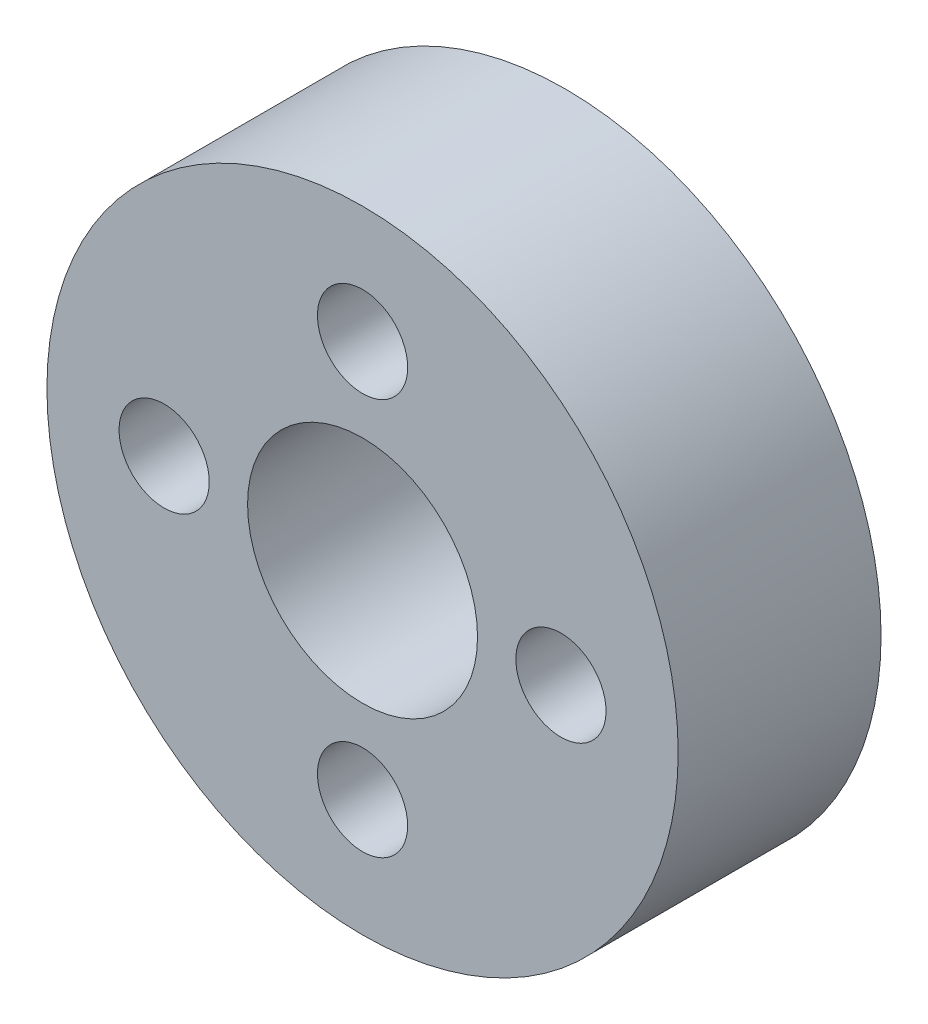
ISO-10303-21;
HEADER;
FILE_DESCRIPTION(('STEP AP214'),'2;1');
FILE_NAME('part.step','',(''),(''),'','','');
FILE_SCHEMA(('AUTOMOTIVE_DESIGN { 1 0 10303 214 1 1 1 1 }'));
ENDSEC;
DATA;
#1=APPLICATION_CONTEXT('core data for automotive mechanical design processes');
#2=APPLICATION_PROTOCOL_DEFINITION('international standard','automotive_design',2000,#1);
#3=PRODUCT_CONTEXT('',#1,'mechanical');
#4=PRODUCT('Part','Part','',(#3));
#5=PRODUCT_RELATED_PRODUCT_CATEGORY('part','',(#4));
#6=PRODUCT_DEFINITION_FORMATION('','',#4);
#7=PRODUCT_DEFINITION_CONTEXT('part definition',#1,'design');
#8=PRODUCT_DEFINITION('design','',#6,#7);
#9=PRODUCT_DEFINITION_SHAPE('','',#8);
#10=(LENGTH_UNIT() NAMED_UNIT(*) SI_UNIT(.MILLI.,.METRE.));
#11=(NAMED_UNIT(*) PLANE_ANGLE_UNIT() SI_UNIT($,.RADIAN.));
#12=(NAMED_UNIT(*) SI_UNIT($,.STERADIAN.) SOLID_ANGLE_UNIT());
#13=UNCERTAINTY_MEASURE_WITH_UNIT(LENGTH_MEASURE(1.E-05),#10,'distance_accuracy_value','');
#14=(GEOMETRIC_REPRESENTATION_CONTEXT(3) GLOBAL_UNCERTAINTY_ASSIGNED_CONTEXT((#13)) GLOBAL_UNIT_ASSIGNED_CONTEXT((#10,
#11,#12)) REPRESENTATION_CONTEXT('',''));
#15=CARTESIAN_POINT('',(0.,0.,0.));
#16=DIRECTION('',(0.,0.,1.));
#17=DIRECTION('',(1.,0.,0.));
#18=AXIS2_PLACEMENT_3D('',#15,#16,#17);
#19=CARTESIAN_POINT('',(0.,0.,0.));
#20=DIRECTION('',(0.,0.,1.));
#21=DIRECTION('',(1.,0.,0.));
#22=AXIS2_PLACEMENT_3D('',#19,#20,#21);
#23=PLANE('',#22);
#24=CARTESIAN_POINT('',(0.,-11.176,0.));
#25=DIRECTION('',(0.,0.,1.));
#26=DIRECTION('',(1.,0.,0.));
#27=AXIS2_PLACEMENT_3D('',#24,#25,#26);
#28=CIRCLE('',#27,2.54);
#29=CARTESIAN_POINT('',(2.54,-11.176,0.));
#30=VERTEX_POINT('',#29);
#31=EDGE_CURVE('E98',#30,#30,#28,.T.);
#32=ORIENTED_EDGE('',*,*,#31,.T.);
#33=EDGE_LOOP('',(#32));
#34=FACE_BOUND('',#33,.T.);
#35=CARTESIAN_POINT('',(0.,11.176,0.));
#36=DIRECTION('',(0.,0.,1.));
#37=DIRECTION('',(1.,0.,0.));
#38=AXIS2_PLACEMENT_3D('',#35,#36,#37);
#39=CIRCLE('',#38,2.54);
#40=CARTESIAN_POINT('',(2.54,11.176,0.));
#41=VERTEX_POINT('',#40);
#42=EDGE_CURVE('E108',#41,#41,#39,.T.);
#43=ORIENTED_EDGE('',*,*,#42,.T.);
#44=EDGE_LOOP('',(#43));
#45=FACE_BOUND('',#44,.T.);
#46=CARTESIAN_POINT('',(11.176,0.,0.));
#47=DIRECTION('',(0.,0.,1.));
#48=DIRECTION('',(1.,0.,0.));
#49=AXIS2_PLACEMENT_3D('',#46,#47,#48);
#50=CIRCLE('',#49,2.54);
#51=CARTESIAN_POINT('',(13.716,0.,0.));
#52=VERTEX_POINT('',#51);
#53=EDGE_CURVE('E113',#52,#52,#50,.T.);
#54=ORIENTED_EDGE('',*,*,#53,.T.);
#55=EDGE_LOOP('',(#54));
#56=FACE_BOUND('',#55,.T.);
#57=CARTESIAN_POINT('',(-11.176,0.,0.));
#58=DIRECTION('',(0.,0.,1.));
#59=DIRECTION('',(1.,0.,0.));
#60=AXIS2_PLACEMENT_3D('',#57,#58,#59);
#61=CIRCLE('',#60,2.54);
#62=CARTESIAN_POINT('',(-8.636,0.,0.));
#63=VERTEX_POINT('',#62);
#64=EDGE_CURVE('E119',#63,#63,#61,.T.);
#65=ORIENTED_EDGE('',*,*,#64,.T.);
#66=EDGE_LOOP('',(#65));
#67=FACE_BOUND('',#66,.T.);
#68=CARTESIAN_POINT('',(0.,0.,0.));
#69=DIRECTION('',(0.,0.,1.));
#70=DIRECTION('',(1.,0.,0.));
#71=AXIS2_PLACEMENT_3D('',#68,#69,#70);
#72=CIRCLE('',#71,17.78);
#73=CARTESIAN_POINT('',(17.78,0.,0.));
#74=VERTEX_POINT('',#73);
#75=EDGE_CURVE('E39',#74,#74,#72,.T.);
#76=ORIENTED_EDGE('',*,*,#75,.F.);
#77=EDGE_LOOP('',(#76));
#78=FACE_BOUND('',#77,.T.);
#79=DIRECTION('',(0.,1.,0.));
#80=VECTOR('',#79,1.);
#81=CARTESIAN_POINT('',(-8.255,-8.255,0.));
#82=LINE('',#81,#80);
#83=CARTESIAN_POINT('',(-8.255,-8.255,0.));
#84=VERTEX_POINT('',#83);
#85=CARTESIAN_POINT('',(-8.255,8.255,0.));
#86=VERTEX_POINT('',#85);
#87=EDGE_CURVE('E97',#84,#86,#82,.T.);
#88=ORIENTED_EDGE('',*,*,#87,.F.);
#89=DIRECTION('',(-1.,0.,0.));
#90=VECTOR('',#89,1.);
#91=CARTESIAN_POINT('',(8.255,-8.255,0.));
#92=LINE('',#91,#90);
#93=CARTESIAN_POINT('',(8.255,-8.255,0.));
#94=VERTEX_POINT('',#93);
#95=EDGE_CURVE('E94',#94,#84,#92,.T.);
#96=ORIENTED_EDGE('',*,*,#95,.F.);
#97=DIRECTION('',(0.,-1.,0.));
#98=VECTOR('',#97,1.);
#99=CARTESIAN_POINT('',(8.255,-8.255,0.));
#100=LINE('',#99,#98);
#101=CARTESIAN_POINT('',(8.255,8.255,0.));
#102=VERTEX_POINT('',#101);
#103=EDGE_CURVE('E55',#102,#94,#100,.T.);
#104=ORIENTED_EDGE('',*,*,#103,.F.);
#105=DIRECTION('',(1.,0.,0.));
#106=VECTOR('',#105,1.);
#107=CARTESIAN_POINT('',(8.255,8.255,0.));
#108=LINE('',#107,#106);
#109=EDGE_CURVE('E50',#86,#102,#108,.T.);
#110=ORIENTED_EDGE('',*,*,#109,.F.);
#111=EDGE_LOOP('',(#88,#96,#104,#110));
#112=FACE_BOUND('',#111,.T.);
#113=ADVANCED_FACE('F35',(#34,#45,#56,#67,#78,#112),#23,.F.);
#114=CARTESIAN_POINT('',(0.,0.,11.43));
#115=DIRECTION('',(0.,0.,1.));
#116=DIRECTION('',(1.,0.,0.));
#117=AXIS2_PLACEMENT_3D('',#114,#115,#116);
#118=PLANE('',#117);
#119=CARTESIAN_POINT('',(0.,11.176,11.43));
#120=DIRECTION('',(0.,0.,1.));
#121=DIRECTION('',(1.,0.,0.));
#122=AXIS2_PLACEMENT_3D('',#119,#120,#121);
#123=CIRCLE('',#122,2.54);
#124=CARTESIAN_POINT('',(2.54,11.176,11.43));
#125=VERTEX_POINT('',#124);
#126=EDGE_CURVE('E110',#125,#125,#123,.T.);
#127=ORIENTED_EDGE('',*,*,#126,.F.);
#128=EDGE_LOOP('',(#127));
#129=FACE_BOUND('',#128,.T.);
#130=CARTESIAN_POINT('',(-11.176,0.,11.43));
#131=DIRECTION('',(0.,0.,1.));
#132=DIRECTION('',(1.,0.,0.));
#133=AXIS2_PLACEMENT_3D('',#130,#131,#132);
#134=CIRCLE('',#133,2.54);
#135=CARTESIAN_POINT('',(-8.636,0.,11.43));
#136=VERTEX_POINT('',#135);
#137=EDGE_CURVE('E122',#136,#136,#134,.T.);
#138=ORIENTED_EDGE('',*,*,#137,.F.);
#139=EDGE_LOOP('',(#138));
#140=FACE_BOUND('',#139,.T.);
#141=CARTESIAN_POINT('',(0.,0.,11.43));
#142=DIRECTION('',(0.,0.,1.));
#143=DIRECTION('',(1.,0.,0.));
#144=AXIS2_PLACEMENT_3D('',#141,#142,#143);
#145=CIRCLE('',#144,17.78);
#146=CARTESIAN_POINT('',(17.78,0.,11.43));
#147=VERTEX_POINT('',#146);
#148=EDGE_CURVE('E11',#147,#147,#145,.T.);
#149=ORIENTED_EDGE('',*,*,#148,.T.);
#150=EDGE_LOOP('',(#149));
#151=FACE_BOUND('',#150,.T.);
#152=CARTESIAN_POINT('',(0.,0.,11.43));
#153=DIRECTION('',(0.,0.,1.));
#154=DIRECTION('',(1.,0.,0.));
#155=AXIS2_PLACEMENT_3D('',#152,#153,#154);
#156=CIRCLE('',#155,6.477);
#157=CARTESIAN_POINT('',(6.477,0.,11.43));
#158=VERTEX_POINT('',#157);
#159=EDGE_CURVE('E125',#158,#158,#156,.T.);
#160=ORIENTED_EDGE('',*,*,#159,.F.);
#161=EDGE_LOOP('',(#160));
#162=FACE_BOUND('',#161,.T.);
#163=CARTESIAN_POINT('',(11.176,0.,11.43));
#164=DIRECTION('',(0.,0.,1.));
#165=DIRECTION('',(1.,0.,0.));
#166=AXIS2_PLACEMENT_3D('',#163,#164,#165);
#167=CIRCLE('',#166,2.54);
#168=CARTESIAN_POINT('',(13.716,0.,11.43));
#169=VERTEX_POINT('',#168);
#170=EDGE_CURVE('E116',#169,#169,#167,.T.);
#171=ORIENTED_EDGE('',*,*,#170,.F.);
#172=EDGE_LOOP('',(#171));
#173=FACE_BOUND('',#172,.T.);
#174=CARTESIAN_POINT('',(0.,-11.176,11.43));
#175=DIRECTION('',(0.,0.,1.));
#176=DIRECTION('',(1.,0.,0.));
#177=AXIS2_PLACEMENT_3D('',#174,#175,#176);
#178=CIRCLE('',#177,2.54);
#179=CARTESIAN_POINT('',(2.54,-11.176,11.43));
#180=VERTEX_POINT('',#179);
#181=EDGE_CURVE('E101',#180,#180,#178,.T.);
#182=ORIENTED_EDGE('',*,*,#181,.F.);
#183=EDGE_LOOP('',(#182));
#184=FACE_BOUND('',#183,.T.);
#185=ADVANCED_FACE('F136',(#129,#140,#151,#162,#173,#184),#118,.T.);
#186=CARTESIAN_POINT('',(0.,0.,11.43));
#187=DIRECTION('',(0.,0.,-1.));
#188=DIRECTION('',(-1.,0.,0.));
#189=AXIS2_PLACEMENT_3D('',#186,#187,#188);
#190=CYLINDRICAL_SURFACE('',#189,17.78);
#191=ORIENTED_EDGE('',*,*,#148,.F.);
#192=EDGE_LOOP('',(#191));
#193=FACE_BOUND('',#192,.T.);
#194=ORIENTED_EDGE('',*,*,#75,.T.);
#195=EDGE_LOOP('',(#194));
#196=FACE_BOUND('',#195,.T.);
#197=ADVANCED_FACE('F37',(#193,#196),#190,.T.);
#198=CARTESIAN_POINT('',(0.,0.,11.43));
#199=DIRECTION('',(0.,0.,-1.));
#200=DIRECTION('',(-1.,0.,0.));
#201=AXIS2_PLACEMENT_3D('',#198,#199,#200);
#202=CYLINDRICAL_SURFACE('',#201,6.477);
#203=ORIENTED_EDGE('',*,*,#159,.T.);
#204=EDGE_LOOP('',(#203));
#205=FACE_BOUND('',#204,.T.);
#206=CARTESIAN_POINT('',(0.,0.,-3.175));
#207=DIRECTION('',(0.,0.,-1.));
#208=DIRECTION('',(-1.,0.,0.));
#209=AXIS2_PLACEMENT_3D('',#206,#207,#208);
#210=CIRCLE('',#209,6.477);
#211=CARTESIAN_POINT('',(-6.477,0.,-3.175));
#212=VERTEX_POINT('',#211);
#213=EDGE_CURVE('E139',#212,#212,#210,.T.);
#214=ORIENTED_EDGE('',*,*,#213,.T.);
#215=EDGE_LOOP('',(#214));
#216=FACE_BOUND('',#215,.T.);
#217=ADVANCED_FACE('F156',(#205,#216),#202,.F.);
#218=CARTESIAN_POINT('',(-11.176,0.,11.43));
#219=DIRECTION('',(0.,0.,-1.));
#220=DIRECTION('',(-1.,0.,0.));
#221=AXIS2_PLACEMENT_3D('',#218,#219,#220);
#222=CYLINDRICAL_SURFACE('',#221,2.54);
#223=ORIENTED_EDGE('',*,*,#137,.T.);
#224=EDGE_LOOP('',(#223));
#225=FACE_BOUND('',#224,.T.);
#226=ORIENTED_EDGE('',*,*,#64,.F.);
#227=EDGE_LOOP('',(#226));
#228=FACE_BOUND('',#227,.T.);
#229=ADVANCED_FACE('F183',(#225,#228),#222,.F.);
#230=CARTESIAN_POINT('',(11.176,0.,11.43));
#231=DIRECTION('',(0.,0.,-1.));
#232=DIRECTION('',(-1.,0.,0.));
#233=AXIS2_PLACEMENT_3D('',#230,#231,#232);
#234=CYLINDRICAL_SURFACE('',#233,2.54);
#235=ORIENTED_EDGE('',*,*,#170,.T.);
#236=EDGE_LOOP('',(#235));
#237=FACE_BOUND('',#236,.T.);
#238=ORIENTED_EDGE('',*,*,#53,.F.);
#239=EDGE_LOOP('',(#238));
#240=FACE_BOUND('',#239,.T.);
#241=ADVANCED_FACE('F179',(#237,#240),#234,.F.);
#242=CARTESIAN_POINT('',(0.,11.176,11.43));
#243=DIRECTION('',(0.,0.,-1.));
#244=DIRECTION('',(-1.,0.,0.));
#245=AXIS2_PLACEMENT_3D('',#242,#243,#244);
#246=CYLINDRICAL_SURFACE('',#245,2.54);
#247=ORIENTED_EDGE('',*,*,#126,.T.);
#248=EDGE_LOOP('',(#247));
#249=FACE_BOUND('',#248,.T.);
#250=ORIENTED_EDGE('',*,*,#42,.F.);
#251=EDGE_LOOP('',(#250));
#252=FACE_BOUND('',#251,.T.);
#253=ADVANCED_FACE('F165',(#249,#252),#246,.F.);
#254=CARTESIAN_POINT('',(0.,-11.176,11.43));
#255=DIRECTION('',(0.,0.,-1.));
#256=DIRECTION('',(-1.,0.,0.));
#257=AXIS2_PLACEMENT_3D('',#254,#255,#256);
#258=CYLINDRICAL_SURFACE('',#257,2.54);
#259=ORIENTED_EDGE('',*,*,#181,.T.);
#260=EDGE_LOOP('',(#259));
#261=FACE_BOUND('',#260,.T.);
#262=ORIENTED_EDGE('',*,*,#31,.F.);
#263=EDGE_LOOP('',(#262));
#264=FACE_BOUND('',#263,.T.);
#265=ADVANCED_FACE('F158',(#261,#264),#258,.F.);
#266=CARTESIAN_POINT('',(0.,0.,-3.175));
#267=DIRECTION('',(0.,0.,1.));
#268=DIRECTION('',(1.,0.,0.));
#269=AXIS2_PLACEMENT_3D('',#266,#267,#268);
#270=PLANE('',#269);
#271=DIRECTION('',(0.,1.,0.));
#272=VECTOR('',#271,1.);
#273=CARTESIAN_POINT('',(-8.255,-8.255,-3.175));
#274=LINE('',#273,#272);
#275=CARTESIAN_POINT('',(-8.255,-8.255,-3.175));
#276=VERTEX_POINT('',#275);
#277=CARTESIAN_POINT('',(-8.255,8.255,-3.175));
#278=VERTEX_POINT('',#277);
#279=EDGE_CURVE('E84',#276,#278,#274,.T.);
#280=ORIENTED_EDGE('',*,*,#279,.T.);
#281=DIRECTION('',(1.,0.,0.));
#282=VECTOR('',#281,1.);
#283=CARTESIAN_POINT('',(8.255,8.255,-3.175));
#284=LINE('',#283,#282);
#285=CARTESIAN_POINT('',(8.255,8.255,-3.175));
#286=VERTEX_POINT('',#285);
#287=EDGE_CURVE('E73',#278,#286,#284,.T.);
#288=ORIENTED_EDGE('',*,*,#287,.T.);
#289=DIRECTION('',(0.,-1.,0.));
#290=VECTOR('',#289,1.);
#291=CARTESIAN_POINT('',(8.255,-8.255,-3.175));
#292=LINE('',#291,#290);
#293=CARTESIAN_POINT('',(8.255,-8.255,-3.175));
#294=VERTEX_POINT('',#293);
#295=EDGE_CURVE('E83',#286,#294,#292,.T.);
#296=ORIENTED_EDGE('',*,*,#295,.T.);
#297=DIRECTION('',(-1.,0.,0.));
#298=VECTOR('',#297,1.);
#299=CARTESIAN_POINT('',(8.255,-8.255,-3.175));
#300=LINE('',#299,#298);
#301=EDGE_CURVE('E90',#294,#276,#300,.T.);
#302=ORIENTED_EDGE('',*,*,#301,.T.);
#303=EDGE_LOOP('',(#280,#288,#296,#302));
#304=FACE_BOUND('',#303,.T.);
#305=ORIENTED_EDGE('',*,*,#213,.F.);
#306=EDGE_LOOP('',(#305));
#307=FACE_BOUND('',#306,.T.);
#308=ADVANCED_FACE('F87',(#304,#307),#270,.F.);
#309=CARTESIAN_POINT('',(-8.255,-8.255,-3.175));
#310=DIRECTION('',(1.,0.,0.));
#311=DIRECTION('',(0.,0.,-1.));
#312=AXIS2_PLACEMENT_3D('',#309,#310,#311);
#313=PLANE('',#312);
#314=ORIENTED_EDGE('',*,*,#87,.T.);
#315=DIRECTION('',(0.,0.,1.));
#316=VECTOR('',#315,1.);
#317=CARTESIAN_POINT('',(-8.255,8.255,-3.175));
#318=LINE('',#317,#316);
#319=EDGE_CURVE('E77',#278,#86,#318,.T.);
#320=ORIENTED_EDGE('',*,*,#319,.F.);
#321=ORIENTED_EDGE('',*,*,#279,.F.);
#322=DIRECTION('',(0.,0.,1.));
#323=VECTOR('',#322,1.);
#324=CARTESIAN_POINT('',(-8.255,-8.255,-3.175));
#325=LINE('',#324,#323);
#326=EDGE_CURVE('E144',#276,#84,#325,.T.);
#327=ORIENTED_EDGE('',*,*,#326,.T.);
#328=EDGE_LOOP('',(#314,#320,#321,#327));
#329=FACE_BOUND('',#328,.T.);
#330=ADVANCED_FACE('F96',(#329),#313,.F.);
#331=CARTESIAN_POINT('',(8.255,8.255,-3.175));
#332=DIRECTION('',(0.,-1.,0.));
#333=DIRECTION('',(0.,0.,-1.));
#334=AXIS2_PLACEMENT_3D('',#331,#332,#333);
#335=PLANE('',#334);
#336=ORIENTED_EDGE('',*,*,#109,.T.);
#337=DIRECTION('',(0.,0.,1.));
#338=VECTOR('',#337,1.);
#339=CARTESIAN_POINT('',(8.255,8.255,-3.175));
#340=LINE('',#339,#338);
#341=EDGE_CURVE('E80',#286,#102,#340,.T.);
#342=ORIENTED_EDGE('',*,*,#341,.F.);
#343=ORIENTED_EDGE('',*,*,#287,.F.);
#344=ORIENTED_EDGE('',*,*,#319,.T.);
#345=EDGE_LOOP('',(#336,#342,#343,#344));
#346=FACE_BOUND('',#345,.T.);
#347=ADVANCED_FACE('F75',(#346),#335,.F.);
#348=CARTESIAN_POINT('',(8.255,-8.255,-3.175));
#349=DIRECTION('',(-1.,0.,0.));
#350=DIRECTION('',(0.,0.,1.));
#351=AXIS2_PLACEMENT_3D('',#348,#349,#350);
#352=PLANE('',#351);
#353=ORIENTED_EDGE('',*,*,#103,.T.);
#354=DIRECTION('',(0.,0.,1.));
#355=VECTOR('',#354,1.);
#356=CARTESIAN_POINT('',(8.255,-8.255,-3.175));
#357=LINE('',#356,#355);
#358=EDGE_CURVE('E103',#294,#94,#357,.T.);
#359=ORIENTED_EDGE('',*,*,#358,.F.);
#360=ORIENTED_EDGE('',*,*,#295,.F.);
#361=ORIENTED_EDGE('',*,*,#341,.T.);
#362=EDGE_LOOP('',(#353,#359,#360,#361));
#363=FACE_BOUND('',#362,.T.);
#364=ADVANCED_FACE('F171',(#363),#352,.F.);
#365=CARTESIAN_POINT('',(8.255,-8.255,-3.175));
#366=DIRECTION('',(0.,1.,0.));
#367=DIRECTION('',(0.,0.,1.));
#368=AXIS2_PLACEMENT_3D('',#365,#366,#367);
#369=PLANE('',#368);
#370=ORIENTED_EDGE('',*,*,#95,.T.);
#371=ORIENTED_EDGE('',*,*,#326,.F.);
#372=ORIENTED_EDGE('',*,*,#301,.F.);
#373=ORIENTED_EDGE('',*,*,#358,.T.);
#374=EDGE_LOOP('',(#370,#371,#372,#373));
#375=FACE_BOUND('',#374,.T.);
#376=ADVANCED_FACE('F143',(#375),#369,.F.);
#377=CLOSED_SHELL('',(#113,#185,#197,#217,#229,#241,#253,#265,#308,#330,#347,#364,#376));
#378=MANIFOLD_SOLID_BREP('B2',#377);
#379=ADVANCED_BREP_SHAPE_REPRESENTATION('',(#18,#378),#14);
#380=SHAPE_DEFINITION_REPRESENTATION(#9,#379);
ENDSEC;
END-ISO-10303-21;
